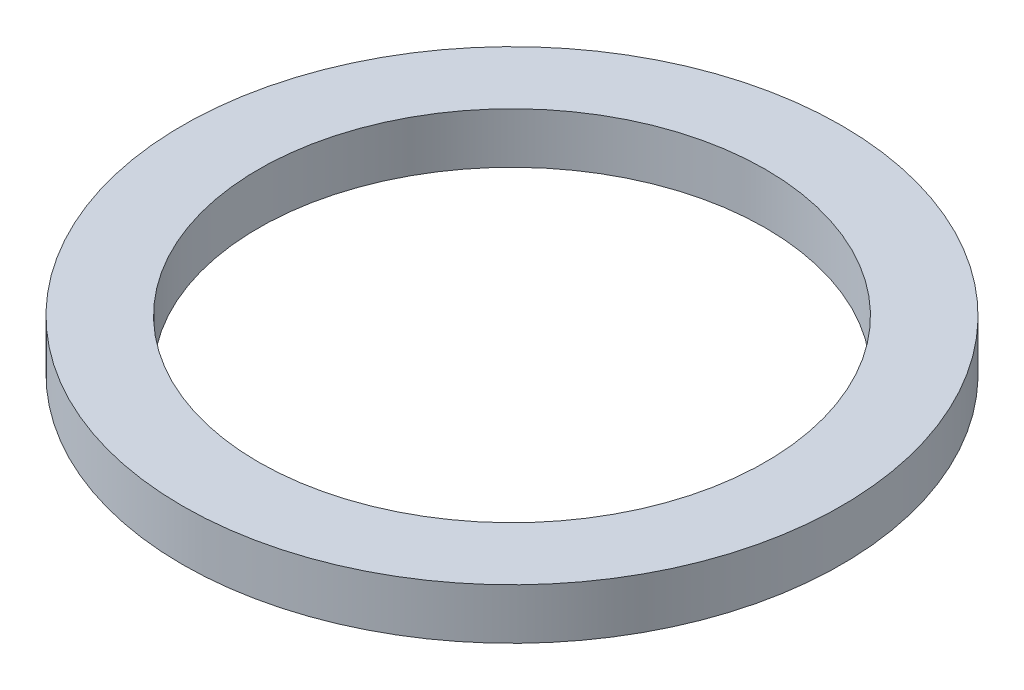
ISO-10303-21;
HEADER;
FILE_DESCRIPTION(('STEP AP214'),'2;1');
FILE_NAME('part.step','',(''),(''),'','','');
FILE_SCHEMA(('AUTOMOTIVE_DESIGN { 1 0 10303 214 1 1 1 1 }'));
ENDSEC;
DATA;
#1=APPLICATION_CONTEXT('core data for automotive mechanical design processes');
#2=APPLICATION_PROTOCOL_DEFINITION('international standard','automotive_design',2000,#1);
#3=PRODUCT_CONTEXT('',#1,'mechanical');
#4=PRODUCT('Part','Part','',(#3));
#5=PRODUCT_RELATED_PRODUCT_CATEGORY('part','',(#4));
#6=PRODUCT_DEFINITION_FORMATION('','',#4);
#7=PRODUCT_DEFINITION_CONTEXT('part definition',#1,'design');
#8=PRODUCT_DEFINITION('design','',#6,#7);
#9=PRODUCT_DEFINITION_SHAPE('','',#8);
#10=(LENGTH_UNIT() NAMED_UNIT(*) SI_UNIT(.MILLI.,.METRE.));
#11=(NAMED_UNIT(*) PLANE_ANGLE_UNIT() SI_UNIT($,.RADIAN.));
#12=(NAMED_UNIT(*) SI_UNIT($,.STERADIAN.) SOLID_ANGLE_UNIT());
#13=UNCERTAINTY_MEASURE_WITH_UNIT(LENGTH_MEASURE(1.E-05),#10,'distance_accuracy_value','');
#14=(GEOMETRIC_REPRESENTATION_CONTEXT(3) GLOBAL_UNCERTAINTY_ASSIGNED_CONTEXT((#13)) GLOBAL_UNIT_ASSIGNED_CONTEXT((#10,
#11,#12)) REPRESENTATION_CONTEXT('',''));
#15=CARTESIAN_POINT('',(0.,0.,0.));
#16=DIRECTION('',(0.,0.,1.));
#17=DIRECTION('',(1.,0.,0.));
#18=AXIS2_PLACEMENT_3D('',#15,#16,#17);
#19=CARTESIAN_POINT('',(0.,4.,0.));
#20=DIRECTION('',(0.,1.,0.));
#21=DIRECTION('',(0.,0.,1.));
#22=AXIS2_PLACEMENT_3D('',#19,#20,#21);
#23=PLANE('',#22);
#24=CARTESIAN_POINT('',(0.,4.,0.));
#25=DIRECTION('',(0.,1.,0.));
#26=DIRECTION('',(0.,0.,1.));
#27=AXIS2_PLACEMENT_3D('',#24,#25,#26);
#28=CIRCLE('',#27,26.);
#29=CARTESIAN_POINT('',(0.,4.,26.));
#30=VERTEX_POINT('',#29);
#31=EDGE_CURVE('E10',#30,#30,#28,.T.);
#32=ORIENTED_EDGE('',*,*,#31,.T.);
#33=EDGE_LOOP('',(#32));
#34=FACE_BOUND('',#33,.T.);
#35=CARTESIAN_POINT('',(0.,4.,0.));
#36=DIRECTION('',(0.,1.,0.));
#37=DIRECTION('',(0.,0.,1.));
#38=AXIS2_PLACEMENT_3D('',#35,#36,#37);
#39=CIRCLE('',#38,20.);
#40=CARTESIAN_POINT('',(0.,4.,20.));
#41=VERTEX_POINT('',#40);
#42=EDGE_CURVE('E43',#41,#41,#39,.T.);
#43=ORIENTED_EDGE('',*,*,#42,.F.);
#44=EDGE_LOOP('',(#43));
#45=FACE_BOUND('',#44,.T.);
#46=ADVANCED_FACE('F32',(#34,#45),#23,.T.);
#47=CARTESIAN_POINT('',(0.,0.,0.));
#48=DIRECTION('',(0.,1.,0.));
#49=DIRECTION('',(0.,0.,1.));
#50=AXIS2_PLACEMENT_3D('',#47,#48,#49);
#51=PLANE('',#50);
#52=CARTESIAN_POINT('',(0.,0.,0.));
#53=DIRECTION('',(0.,1.,0.));
#54=DIRECTION('',(0.,0.,1.));
#55=AXIS2_PLACEMENT_3D('',#52,#53,#54);
#56=CIRCLE('',#55,26.);
#57=CARTESIAN_POINT('',(0.,0.,26.));
#58=VERTEX_POINT('',#57);
#59=EDGE_CURVE('E36',#58,#58,#56,.T.);
#60=ORIENTED_EDGE('',*,*,#59,.F.);
#61=EDGE_LOOP('',(#60));
#62=FACE_BOUND('',#61,.T.);
#63=CARTESIAN_POINT('',(0.,0.,0.));
#64=DIRECTION('',(0.,1.,0.));
#65=DIRECTION('',(0.,0.,1.));
#66=AXIS2_PLACEMENT_3D('',#63,#64,#65);
#67=CIRCLE('',#66,20.);
#68=CARTESIAN_POINT('',(0.,0.,20.));
#69=VERTEX_POINT('',#68);
#70=EDGE_CURVE('E45',#69,#69,#67,.T.);
#71=ORIENTED_EDGE('',*,*,#70,.T.);
#72=EDGE_LOOP('',(#71));
#73=FACE_BOUND('',#72,.T.);
#74=ADVANCED_FACE('F55',(#62,#73),#51,.F.);
#75=CARTESIAN_POINT('',(0.,4.,0.));
#76=DIRECTION('',(0.,-1.,0.));
#77=DIRECTION('',(0.,0.,-1.));
#78=AXIS2_PLACEMENT_3D('',#75,#76,#77);
#79=CYLINDRICAL_SURFACE('',#78,26.);
#80=ORIENTED_EDGE('',*,*,#31,.F.);
#81=EDGE_LOOP('',(#80));
#82=FACE_BOUND('',#81,.T.);
#83=ORIENTED_EDGE('',*,*,#59,.T.);
#84=EDGE_LOOP('',(#83));
#85=FACE_BOUND('',#84,.T.);
#86=ADVANCED_FACE('F34',(#82,#85),#79,.T.);
#87=CARTESIAN_POINT('',(0.,4.,0.));
#88=DIRECTION('',(0.,-1.,0.));
#89=DIRECTION('',(0.,0.,-1.));
#90=AXIS2_PLACEMENT_3D('',#87,#88,#89);
#91=CYLINDRICAL_SURFACE('',#90,20.);
#92=ORIENTED_EDGE('',*,*,#42,.T.);
#93=EDGE_LOOP('',(#92));
#94=FACE_BOUND('',#93,.T.);
#95=ORIENTED_EDGE('',*,*,#70,.F.);
#96=EDGE_LOOP('',(#95));
#97=FACE_BOUND('',#96,.T.);
#98=ADVANCED_FACE('F51',(#94,#97),#91,.F.);
#99=CLOSED_SHELL('',(#46,#74,#86,#98));
#100=MANIFOLD_SOLID_BREP('B2',#99);
#101=ADVANCED_BREP_SHAPE_REPRESENTATION('',(#18,#100),#14);
#102=SHAPE_DEFINITION_REPRESENTATION(#9,#101);
ENDSEC;
END-ISO-10303-21;
